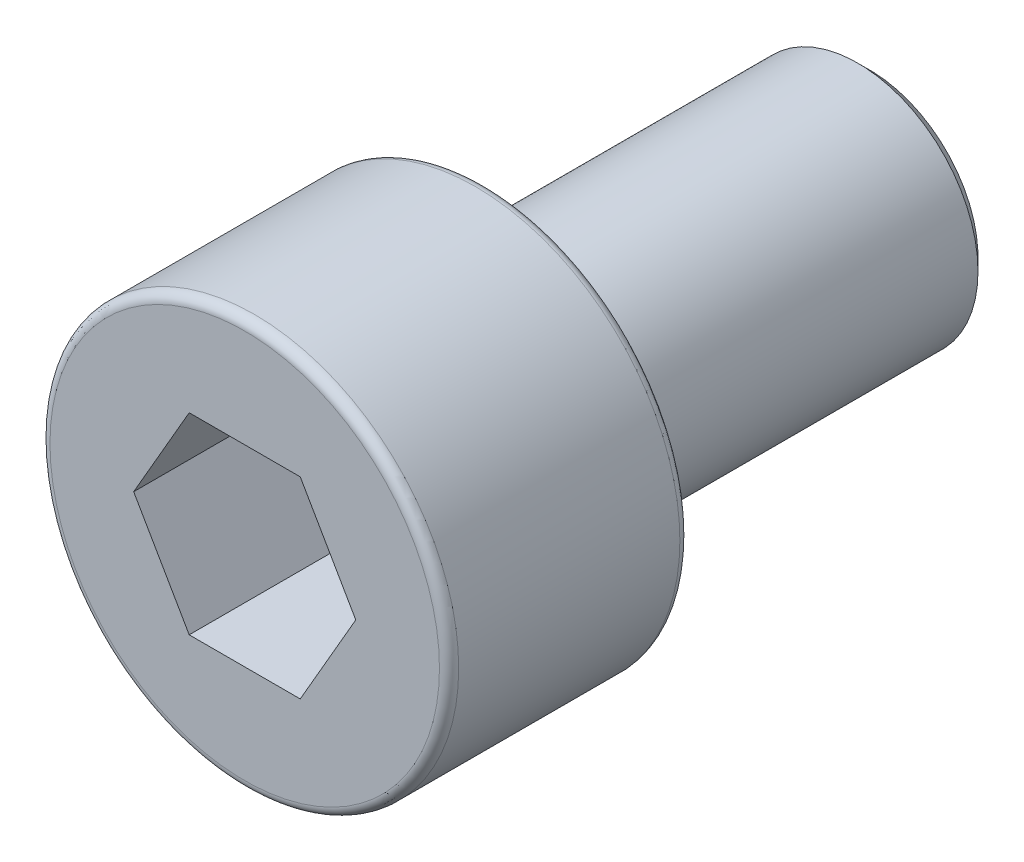
ISO-10303-21;
HEADER;
FILE_DESCRIPTION(('STEP AP214'),'2;1');
FILE_NAME('part.step','',(''),(''),'','','');
FILE_SCHEMA(('AUTOMOTIVE_DESIGN { 1 0 10303 214 1 1 1 1 }'));
ENDSEC;
DATA;
#1=APPLICATION_CONTEXT('core data for automotive mechanical design processes');
#2=APPLICATION_PROTOCOL_DEFINITION('international standard','automotive_design',2000,#1);
#3=PRODUCT_CONTEXT('',#1,'mechanical');
#4=PRODUCT('Part','Part','',(#3));
#5=PRODUCT_RELATED_PRODUCT_CATEGORY('part','',(#4));
#6=PRODUCT_DEFINITION_FORMATION('','',#4);
#7=PRODUCT_DEFINITION_CONTEXT('part definition',#1,'design');
#8=PRODUCT_DEFINITION('design','',#6,#7);
#9=PRODUCT_DEFINITION_SHAPE('','',#8);
#10=(LENGTH_UNIT() NAMED_UNIT(*) SI_UNIT(.MILLI.,.METRE.));
#11=(NAMED_UNIT(*) PLANE_ANGLE_UNIT() SI_UNIT($,.RADIAN.));
#12=(NAMED_UNIT(*) SI_UNIT($,.STERADIAN.) SOLID_ANGLE_UNIT());
#13=UNCERTAINTY_MEASURE_WITH_UNIT(LENGTH_MEASURE(1.E-05),#10,'distance_accuracy_value','');
#14=(GEOMETRIC_REPRESENTATION_CONTEXT(3) GLOBAL_UNCERTAINTY_ASSIGNED_CONTEXT((#13)) GLOBAL_UNIT_ASSIGNED_CONTEXT((#10,
#11,#12)) REPRESENTATION_CONTEXT('',''));
#15=CARTESIAN_POINT('',(0.,0.,0.));
#16=DIRECTION('',(0.,0.,1.));
#17=DIRECTION('',(1.,0.,0.));
#18=AXIS2_PLACEMENT_3D('',#15,#16,#17);
#19=CARTESIAN_POINT('',(0.,0.,8.));
#20=DIRECTION('',(0.,0.,-1.));
#21=DIRECTION('',(-1.,0.,0.));
#22=AXIS2_PLACEMENT_3D('',#19,#20,#21);
#23=PLANE('',#22);
#24=CARTESIAN_POINT('',(0.,0.,8.));
#25=DIRECTION('',(0.,0.,-1.));
#26=DIRECTION('',(-1.,0.,0.));
#27=AXIS2_PLACEMENT_3D('',#24,#25,#26);
#28=CIRCLE('',#27,4.05);
#29=CARTESIAN_POINT('',(-4.05,0.,8.));
#30=VERTEX_POINT('',#29);
#31=EDGE_CURVE('E40',#30,#30,#28,.T.);
#32=ORIENTED_EDGE('',*,*,#31,.T.);
#33=EDGE_LOOP('',(#32));
#34=FACE_BOUND('',#33,.T.);
#35=CARTESIAN_POINT('',(0.,0.,8.));
#36=DIRECTION('',(0.,0.,-1.));
#37=DIRECTION('',(-1.,0.,0.));
#38=AXIS2_PLACEMENT_3D('',#35,#36,#37);
#39=CIRCLE('',#38,2.5);
#40=CARTESIAN_POINT('',(-2.5,0.,8.));
#41=VERTEX_POINT('',#40);
#42=EDGE_CURVE('E134',#41,#41,#39,.T.);
#43=ORIENTED_EDGE('',*,*,#42,.F.);
#44=EDGE_LOOP('',(#43));
#45=FACE_BOUND('',#44,.T.);
#46=ADVANCED_FACE('F32',(#34,#45),#23,.T.);
#47=CARTESIAN_POINT('',(0.,0.,8.));
#48=DIRECTION('',(0.,0.,1.));
#49=DIRECTION('',(1.,0.,0.));
#50=AXIS2_PLACEMENT_3D('',#47,#48,#49);
#51=CYLINDRICAL_SURFACE('',#50,4.25);
#52=CARTESIAN_POINT('',(0.,0.,8.2));
#53=DIRECTION('',(0.,0.,-1.));
#54=DIRECTION('',(-1.,0.,0.));
#55=AXIS2_PLACEMENT_3D('',#52,#53,#54);
#56=CIRCLE('',#55,4.25);
#57=CARTESIAN_POINT('',(-4.25,0.,8.2));
#58=VERTEX_POINT('',#57);
#59=EDGE_CURVE('E151',#58,#58,#56,.F.);
#60=ORIENTED_EDGE('',*,*,#59,.T.);
#61=EDGE_LOOP('',(#60));
#62=FACE_BOUND('',#61,.T.);
#63=CARTESIAN_POINT('',(0.,0.,12.8));
#64=DIRECTION('',(0.,0.,-1.));
#65=DIRECTION('',(-1.,0.,0.));
#66=AXIS2_PLACEMENT_3D('',#63,#64,#65);
#67=CIRCLE('',#66,4.25);
#68=CARTESIAN_POINT('',(-4.25,0.,12.8));
#69=VERTEX_POINT('',#68);
#70=EDGE_CURVE('E148',#69,#69,#67,.T.);
#71=ORIENTED_EDGE('',*,*,#70,.T.);
#72=EDGE_LOOP('',(#71));
#73=FACE_BOUND('',#72,.T.);
#74=ADVANCED_FACE('F164',(#62,#73),#51,.T.);
#75=CARTESIAN_POINT('',(0.,0.,13.));
#76=DIRECTION('',(0.,0.,-1.));
#77=DIRECTION('',(-1.,0.,0.));
#78=AXIS2_PLACEMENT_3D('',#75,#76,#77);
#79=PLANE('',#78);
#80=CARTESIAN_POINT('',(0.,0.,13.));
#81=DIRECTION('',(0.,0.,-1.));
#82=DIRECTION('',(-1.,0.,0.));
#83=AXIS2_PLACEMENT_3D('',#80,#81,#82);
#84=CIRCLE('',#83,4.05);
#85=CARTESIAN_POINT('',(-4.05,0.,13.));
#86=VERTEX_POINT('',#85);
#87=EDGE_CURVE('E11',#86,#86,#84,.F.);
#88=ORIENTED_EDGE('',*,*,#87,.T.);
#89=EDGE_LOOP('',(#88));
#90=FACE_BOUND('',#89,.T.);
#91=DIRECTION('',(0.499999999999999,-0.866025403784439,0.));
#92=VECTOR('',#91,1.);
#93=CARTESIAN_POINT('',(-2.3094010767585,0.,13.));
#94=LINE('',#93,#92);
#95=CARTESIAN_POINT('',(-2.3094010767585,0.,13.));
#96=VERTEX_POINT('',#95);
#97=CARTESIAN_POINT('',(-1.15470053837925,-2.,13.));
#98=VERTEX_POINT('',#97);
#99=EDGE_CURVE('E121',#96,#98,#94,.T.);
#100=ORIENTED_EDGE('',*,*,#99,.F.);
#101=DIRECTION('',(-0.499999999999999,-0.866025403784439,0.));
#102=VECTOR('',#101,1.);
#103=CARTESIAN_POINT('',(-1.15470053837925,2.,13.));
#104=LINE('',#103,#102);
#105=CARTESIAN_POINT('',(-1.15470053837925,2.,13.));
#106=VERTEX_POINT('',#105);
#107=EDGE_CURVE('E47',#106,#96,#104,.T.);
#108=ORIENTED_EDGE('',*,*,#107,.F.);
#109=DIRECTION('',(-1.,0.,0.));
#110=VECTOR('',#109,1.);
#111=CARTESIAN_POINT('',(1.15470053837925,2.,13.));
#112=LINE('',#111,#110);
#113=CARTESIAN_POINT('',(1.15470053837925,2.,13.));
#114=VERTEX_POINT('',#113);
#115=EDGE_CURVE('E130',#114,#106,#112,.T.);
#116=ORIENTED_EDGE('',*,*,#115,.F.);
#117=DIRECTION('',(-0.499999999999999,0.866025403784439,0.));
#118=VECTOR('',#117,1.);
#119=CARTESIAN_POINT('',(2.3094010767585,0.,13.));
#120=LINE('',#119,#118);
#121=CARTESIAN_POINT('',(2.3094010767585,0.,13.));
#122=VERTEX_POINT('',#121);
#123=EDGE_CURVE('E128',#122,#114,#120,.T.);
#124=ORIENTED_EDGE('',*,*,#123,.F.);
#125=DIRECTION('',(0.499999999999999,0.866025403784439,0.));
#126=VECTOR('',#125,1.);
#127=CARTESIAN_POINT('',(1.15470053837925,-2.,13.));
#128=LINE('',#127,#126);
#129=CARTESIAN_POINT('',(1.15470053837925,-2.,13.));
#130=VERTEX_POINT('',#129);
#131=EDGE_CURVE('E95',#130,#122,#128,.T.);
#132=ORIENTED_EDGE('',*,*,#131,.F.);
#133=DIRECTION('',(1.,0.,0.));
#134=VECTOR('',#133,1.);
#135=CARTESIAN_POINT('',(-1.15470053837925,-2.,13.));
#136=LINE('',#135,#134);
#137=EDGE_CURVE('E124',#98,#130,#136,.T.);
#138=ORIENTED_EDGE('',*,*,#137,.F.);
#139=EDGE_LOOP('',(#100,#108,#116,#124,#132,#138));
#140=FACE_BOUND('',#139,.T.);
#141=ADVANCED_FACE('F167',(#90,#140),#79,.F.);
#142=CARTESIAN_POINT('',(0.,0.,0.));
#143=DIRECTION('',(0.,0.,1.));
#144=DIRECTION('',(1.,0.,0.));
#145=AXIS2_PLACEMENT_3D('',#142,#143,#144);
#146=CYLINDRICAL_SURFACE('',#145,2.5);
#147=CARTESIAN_POINT('',(0.,0.,0.250000000055028));
#148=DIRECTION('',(0.,0.,-1.));
#149=DIRECTION('',(-1.,0.,0.));
#150=AXIS2_PLACEMENT_3D('',#147,#148,#149);
#151=CIRCLE('',#150,2.5);
#152=CARTESIAN_POINT('',(-2.5,0.,0.250000000055028));
#153=VERTEX_POINT('',#152);
#154=EDGE_CURVE('E145',#153,#153,#151,.F.);
#155=ORIENTED_EDGE('',*,*,#154,.T.);
#156=EDGE_LOOP('',(#155));
#157=FACE_BOUND('',#156,.T.);
#158=ORIENTED_EDGE('',*,*,#42,.T.);
#159=EDGE_LOOP('',(#158));
#160=FACE_BOUND('',#159,.T.);
#161=ADVANCED_FACE('F177',(#157,#160),#146,.T.);
#162=CARTESIAN_POINT('',(0.,0.,0.));
#163=DIRECTION('',(0.,0.,-1.));
#164=DIRECTION('',(-1.,0.,0.));
#165=AXIS2_PLACEMENT_3D('',#162,#163,#164);
#166=PLANE('',#165);
#167=CARTESIAN_POINT('',(0.,0.,0.));
#168=DIRECTION('',(0.,0.,-1.));
#169=DIRECTION('',(-1.,0.,0.));
#170=AXIS2_PLACEMENT_3D('',#167,#168,#169);
#171=CIRCLE('',#170,2.24999999994497);
#172=CARTESIAN_POINT('',(-2.24999999994497,0.,0.));
#173=VERTEX_POINT('',#172);
#174=EDGE_CURVE('E142',#173,#173,#171,.T.);
#175=ORIENTED_EDGE('',*,*,#174,.T.);
#176=EDGE_LOOP('',(#175));
#177=FACE_BOUND('',#176,.T.);
#178=ADVANCED_FACE('F188',(#177),#166,.T.);
#179=CARTESIAN_POINT('',(-1.15470053837925,2.,9.));
#180=DIRECTION('',(-0.866025403784439,0.499999999999999,0.));
#181=DIRECTION('',(-0.499999999999999,-0.866025403784439,0.));
#182=AXIS2_PLACEMENT_3D('',#179,#180,#181);
#183=PLANE('',#182);
#184=ORIENTED_EDGE('',*,*,#107,.T.);
#185=DIRECTION('',(0.,0.,1.));
#186=VECTOR('',#185,1.);
#187=CARTESIAN_POINT('',(-2.3094010767585,0.,9.));
#188=LINE('',#187,#186);
#189=CARTESIAN_POINT('',(-2.3094010767585,0.,9.));
#190=VERTEX_POINT('',#189);
#191=EDGE_CURVE('E77',#190,#96,#188,.T.);
#192=ORIENTED_EDGE('',*,*,#191,.F.);
#193=DIRECTION('',(-0.499999999999999,-0.866025403784439,0.));
#194=VECTOR('',#193,1.);
#195=CARTESIAN_POINT('',(-1.15470053837925,2.,9.));
#196=LINE('',#195,#194);
#197=CARTESIAN_POINT('',(-1.15470053837925,2.,9.));
#198=VERTEX_POINT('',#197);
#199=EDGE_CURVE('E132',#198,#190,#196,.T.);
#200=ORIENTED_EDGE('',*,*,#199,.F.);
#201=DIRECTION('',(0.,0.,1.));
#202=VECTOR('',#201,1.);
#203=CARTESIAN_POINT('',(-1.15470053837925,2.,9.));
#204=LINE('',#203,#202);
#205=EDGE_CURVE('E55',#198,#106,#204,.T.);
#206=ORIENTED_EDGE('',*,*,#205,.T.);
#207=EDGE_LOOP('',(#184,#192,#200,#206));
#208=FACE_BOUND('',#207,.T.);
#209=ADVANCED_FACE('F185',(#208),#183,.F.);
#210=CARTESIAN_POINT('',(1.15470053837925,2.,9.));
#211=DIRECTION('',(0.,1.,0.));
#212=DIRECTION('',(-1.,0.,0.));
#213=AXIS2_PLACEMENT_3D('',#210,#211,#212);
#214=PLANE('',#213);
#215=ORIENTED_EDGE('',*,*,#115,.T.);
#216=ORIENTED_EDGE('',*,*,#205,.F.);
#217=DIRECTION('',(-1.,0.,0.));
#218=VECTOR('',#217,1.);
#219=CARTESIAN_POINT('',(1.15470053837925,2.,9.));
#220=LINE('',#219,#218);
#221=CARTESIAN_POINT('',(1.15470053837925,2.,9.));
#222=VERTEX_POINT('',#221);
#223=EDGE_CURVE('E107',#222,#198,#220,.T.);
#224=ORIENTED_EDGE('',*,*,#223,.F.);
#225=DIRECTION('',(0.,0.,1.));
#226=VECTOR('',#225,1.);
#227=CARTESIAN_POINT('',(1.15470053837925,2.,9.));
#228=LINE('',#227,#226);
#229=EDGE_CURVE('E99',#222,#114,#228,.T.);
#230=ORIENTED_EDGE('',*,*,#229,.T.);
#231=EDGE_LOOP('',(#215,#216,#224,#230));
#232=FACE_BOUND('',#231,.T.);
#233=ADVANCED_FACE('F187',(#232),#214,.F.);
#234=CARTESIAN_POINT('',(2.3094010767585,0.,9.));
#235=DIRECTION('',(0.866025403784439,0.499999999999999,0.));
#236=DIRECTION('',(-0.499999999999999,0.866025403784439,0.));
#237=AXIS2_PLACEMENT_3D('',#234,#235,#236);
#238=PLANE('',#237);
#239=ORIENTED_EDGE('',*,*,#123,.T.);
#240=ORIENTED_EDGE('',*,*,#229,.F.);
#241=DIRECTION('',(-0.499999999999999,0.866025403784439,0.));
#242=VECTOR('',#241,1.);
#243=CARTESIAN_POINT('',(2.3094010767585,0.,9.));
#244=LINE('',#243,#242);
#245=CARTESIAN_POINT('',(2.3094010767585,0.,9.));
#246=VERTEX_POINT('',#245);
#247=EDGE_CURVE('E103',#246,#222,#244,.T.);
#248=ORIENTED_EDGE('',*,*,#247,.F.);
#249=DIRECTION('',(0.,0.,1.));
#250=VECTOR('',#249,1.);
#251=CARTESIAN_POINT('',(2.3094010767585,0.,9.));
#252=LINE('',#251,#250);
#253=EDGE_CURVE('E88',#246,#122,#252,.T.);
#254=ORIENTED_EDGE('',*,*,#253,.T.);
#255=EDGE_LOOP('',(#239,#240,#248,#254));
#256=FACE_BOUND('',#255,.T.);
#257=ADVANCED_FACE('F104',(#256),#238,.F.);
#258=CARTESIAN_POINT('',(1.15470053837925,-2.,9.));
#259=DIRECTION('',(0.866025403784439,-0.499999999999999,0.));
#260=DIRECTION('',(0.5,0.866025403784439,0.));
#261=AXIS2_PLACEMENT_3D('',#258,#259,#260);
#262=PLANE('',#261);
#263=ORIENTED_EDGE('',*,*,#131,.T.);
#264=ORIENTED_EDGE('',*,*,#253,.F.);
#265=DIRECTION('',(0.499999999999999,0.866025403784439,0.));
#266=VECTOR('',#265,1.);
#267=CARTESIAN_POINT('',(1.15470053837925,-2.,9.));
#268=LINE('',#267,#266);
#269=CARTESIAN_POINT('',(1.15470053837925,-2.,9.));
#270=VERTEX_POINT('',#269);
#271=EDGE_CURVE('E92',#270,#246,#268,.T.);
#272=ORIENTED_EDGE('',*,*,#271,.F.);
#273=DIRECTION('',(0.,0.,1.));
#274=VECTOR('',#273,1.);
#275=CARTESIAN_POINT('',(1.15470053837925,-2.,9.));
#276=LINE('',#275,#274);
#277=EDGE_CURVE('E100',#270,#130,#276,.T.);
#278=ORIENTED_EDGE('',*,*,#277,.T.);
#279=EDGE_LOOP('',(#263,#264,#272,#278));
#280=FACE_BOUND('',#279,.T.);
#281=ADVANCED_FACE('F90',(#280),#262,.F.);
#282=CARTESIAN_POINT('',(-1.15470053837925,-2.,9.));
#283=DIRECTION('',(0.,-1.,0.));
#284=DIRECTION('',(1.,0.,0.));
#285=AXIS2_PLACEMENT_3D('',#282,#283,#284);
#286=PLANE('',#285);
#287=ORIENTED_EDGE('',*,*,#137,.T.);
#288=ORIENTED_EDGE('',*,*,#277,.F.);
#289=DIRECTION('',(1.,0.,0.));
#290=VECTOR('',#289,1.);
#291=CARTESIAN_POINT('',(-1.15470053837925,-2.,9.));
#292=LINE('',#291,#290);
#293=CARTESIAN_POINT('',(-1.15470053837925,-2.,9.));
#294=VERTEX_POINT('',#293);
#295=EDGE_CURVE('E113',#294,#270,#292,.T.);
#296=ORIENTED_EDGE('',*,*,#295,.F.);
#297=DIRECTION('',(0.,0.,1.));
#298=VECTOR('',#297,1.);
#299=CARTESIAN_POINT('',(-1.15470053837925,-2.,9.));
#300=LINE('',#299,#298);
#301=EDGE_CURVE('E137',#294,#98,#300,.T.);
#302=ORIENTED_EDGE('',*,*,#301,.T.);
#303=EDGE_LOOP('',(#287,#288,#296,#302));
#304=FACE_BOUND('',#303,.T.);
#305=ADVANCED_FACE('F273',(#304),#286,.F.);
#306=CARTESIAN_POINT('',(-2.3094010767585,0.,9.));
#307=DIRECTION('',(-0.866025403784439,-0.499999999999999,0.));
#308=DIRECTION('',(0.499999999999999,-0.866025403784439,0.));
#309=AXIS2_PLACEMENT_3D('',#306,#307,#308);
#310=PLANE('',#309);
#311=ORIENTED_EDGE('',*,*,#99,.T.);
#312=ORIENTED_EDGE('',*,*,#301,.F.);
#313=DIRECTION('',(0.499999999999999,-0.866025403784439,0.));
#314=VECTOR('',#313,1.);
#315=CARTESIAN_POINT('',(-2.3094010767585,0.,9.));
#316=LINE('',#315,#314);
#317=EDGE_CURVE('E115',#190,#294,#316,.T.);
#318=ORIENTED_EDGE('',*,*,#317,.F.);
#319=ORIENTED_EDGE('',*,*,#191,.T.);
#320=EDGE_LOOP('',(#311,#312,#318,#319));
#321=FACE_BOUND('',#320,.T.);
#322=ADVANCED_FACE('F183',(#321),#310,.F.);
#323=CARTESIAN_POINT('',(0.,0.,9.));
#324=DIRECTION('',(0.,0.,1.));
#325=DIRECTION('',(1.,0.,0.));
#326=AXIS2_PLACEMENT_3D('',#323,#324,#325);
#327=PLANE('',#326);
#328=ORIENTED_EDGE('',*,*,#199,.T.);
#329=ORIENTED_EDGE('',*,*,#317,.T.);
#330=ORIENTED_EDGE('',*,*,#295,.T.);
#331=ORIENTED_EDGE('',*,*,#271,.T.);
#332=ORIENTED_EDGE('',*,*,#247,.T.);
#333=ORIENTED_EDGE('',*,*,#223,.T.);
#334=EDGE_LOOP('',(#328,#329,#330,#331,#332,#333));
#335=FACE_BOUND('',#334,.T.);
#336=ADVANCED_FACE('F110',(#335),#327,.T.);
#337=CARTESIAN_POINT('',(0.,0.,0.));
#338=DIRECTION('',(0.,0.,1.));
#339=DIRECTION('',(1.,0.,0.));
#340=AXIS2_PLACEMENT_3D('',#337,#338,#339);
#341=CONICAL_SURFACE('',#340,2.24999999994497,0.785398163397449);
#342=ORIENTED_EDGE('',*,*,#154,.F.);
#343=EDGE_LOOP('',(#342));
#344=FACE_BOUND('',#343,.T.);
#345=ORIENTED_EDGE('',*,*,#174,.F.);
#346=EDGE_LOOP('',(#345));
#347=FACE_BOUND('',#346,.T.);
#348=ADVANCED_FACE('F161',(#344,#347),#341,.T.);
#349=CARTESIAN_POINT('',(0.,0.,8.2));
#350=DIRECTION('',(0.,0.,-1.));
#351=DIRECTION('',(-1.,0.,0.));
#352=AXIS2_PLACEMENT_3D('',#349,#350,#351);
#353=TOROIDAL_SURFACE('',#352,4.05,0.2);
#354=ORIENTED_EDGE('',*,*,#31,.F.);
#355=EDGE_LOOP('',(#354));
#356=FACE_BOUND('',#355,.T.);
#357=ORIENTED_EDGE('',*,*,#59,.F.);
#358=EDGE_LOOP('',(#357));
#359=FACE_BOUND('',#358,.T.);
#360=ADVANCED_FACE('F158',(#356,#359),#353,.T.);
#361=CARTESIAN_POINT('',(0.,0.,12.8));
#362=DIRECTION('',(0.,0.,-1.));
#363=DIRECTION('',(-1.,0.,0.));
#364=AXIS2_PLACEMENT_3D('',#361,#362,#363);
#365=TOROIDAL_SURFACE('',#364,4.05,0.2);
#366=ORIENTED_EDGE('',*,*,#70,.F.);
#367=EDGE_LOOP('',(#366));
#368=FACE_BOUND('',#367,.T.);
#369=ORIENTED_EDGE('',*,*,#87,.F.);
#370=EDGE_LOOP('',(#369));
#371=FACE_BOUND('',#370,.T.);
#372=ADVANCED_FACE('F34',(#368,#371),#365,.T.);
#373=CLOSED_SHELL('',(#46,#74,#141,#161,#178,#209,#233,#257,#281,#305,#322,#336,#348,#360,#372));
#374=MANIFOLD_SOLID_BREP('B2',#373);
#375=ADVANCED_BREP_SHAPE_REPRESENTATION('',(#18,#374),#14);
#376=SHAPE_DEFINITION_REPRESENTATION(#9,#375);
ENDSEC;
END-ISO-10303-21;
